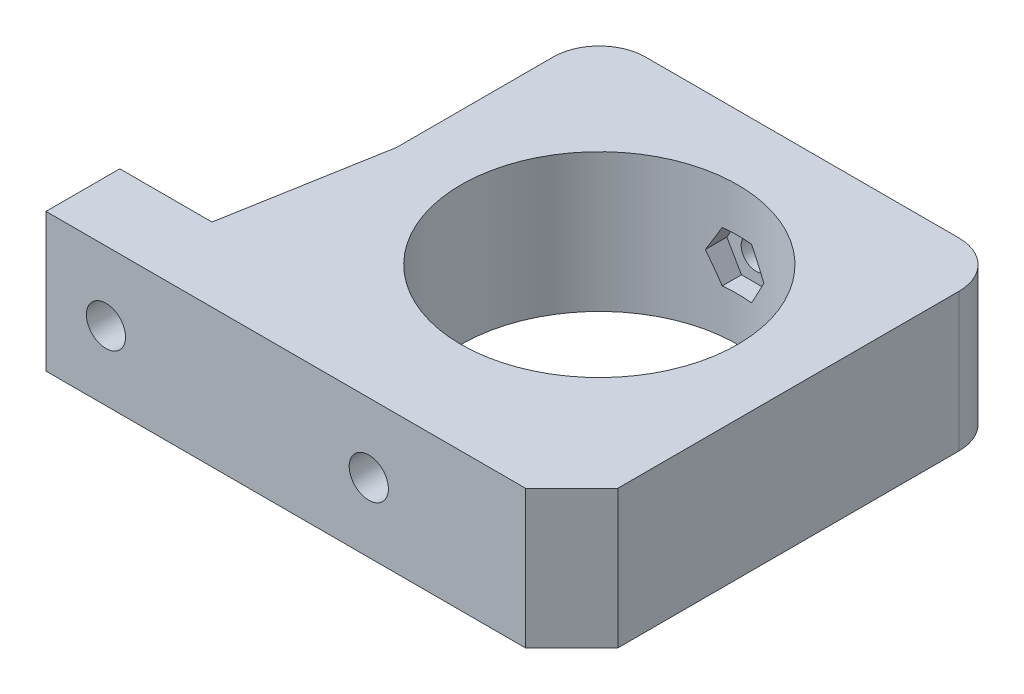
ISO-10303-21;
HEADER;
FILE_DESCRIPTION(('STEP AP214'),'2;1');
FILE_NAME('part.step','',(''),(''),'','','');
FILE_SCHEMA(('AUTOMOTIVE_DESIGN { 1 0 10303 214 1 1 1 1 }'));
ENDSEC;
DATA;
#1=APPLICATION_CONTEXT('core data for automotive mechanical design processes');
#2=APPLICATION_PROTOCOL_DEFINITION('international standard','automotive_design',2000,#1);
#3=PRODUCT_CONTEXT('',#1,'mechanical');
#4=PRODUCT('Part','Part','',(#3));
#5=PRODUCT_RELATED_PRODUCT_CATEGORY('part','',(#4));
#6=PRODUCT_DEFINITION_FORMATION('','',#4);
#7=PRODUCT_DEFINITION_CONTEXT('part definition',#1,'design');
#8=PRODUCT_DEFINITION('design','',#6,#7);
#9=PRODUCT_DEFINITION_SHAPE('','',#8);
#10=(LENGTH_UNIT() NAMED_UNIT(*) SI_UNIT(.MILLI.,.METRE.));
#11=(NAMED_UNIT(*) PLANE_ANGLE_UNIT() SI_UNIT($,.RADIAN.));
#12=(NAMED_UNIT(*) SI_UNIT($,.STERADIAN.) SOLID_ANGLE_UNIT());
#13=UNCERTAINTY_MEASURE_WITH_UNIT(LENGTH_MEASURE(1.E-05),#10,'distance_accuracy_value','');
#14=(GEOMETRIC_REPRESENTATION_CONTEXT(3) GLOBAL_UNCERTAINTY_ASSIGNED_CONTEXT((#13)) GLOBAL_UNIT_ASSIGNED_CONTEXT((#10,
#11,#12)) REPRESENTATION_CONTEXT('',''));
#15=CARTESIAN_POINT('',(0.,0.,0.));
#16=DIRECTION('',(0.,0.,1.));
#17=DIRECTION('',(1.,0.,0.));
#18=AXIS2_PLACEMENT_3D('',#15,#16,#17);
#19=CARTESIAN_POINT('',(-28.5,7.5,-22.001));
#20=DIRECTION('',(0.,0.,1.));
#21=DIRECTION('',(1.,0.,0.));
#22=AXIS2_PLACEMENT_3D('',#19,#20,#21);
#23=CYLINDRICAL_SURFACE('',#22,2.125);
#24=CARTESIAN_POINT('',(-28.5,7.5,25.));
#25=DIRECTION('',(0.,0.,1.));
#26=DIRECTION('',(1.,0.,0.));
#27=AXIS2_PLACEMENT_3D('',#24,#25,#26);
#28=CIRCLE('',#27,2.125);
#29=CARTESIAN_POINT('',(-26.375,7.5,25.));
#30=VERTEX_POINT('',#29);
#31=EDGE_CURVE('E272',#30,#30,#28,.T.);
#32=ORIENTED_EDGE('',*,*,#31,.T.);
#33=EDGE_LOOP('',(#32));
#34=FACE_BOUND('',#33,.T.);
#35=CARTESIAN_POINT('',(-28.5,7.5,20.));
#36=DIRECTION('',(0.,0.,-1.));
#37=DIRECTION('',(-1.,0.,0.));
#38=AXIS2_PLACEMENT_3D('',#35,#36,#37);
#39=CIRCLE('',#38,2.125);
#40=CARTESIAN_POINT('',(-30.625,7.5,20.));
#41=VERTEX_POINT('',#40);
#42=EDGE_CURVE('E297',#41,#41,#39,.F.);
#43=ORIENTED_EDGE('',*,*,#42,.F.);
#44=EDGE_LOOP('',(#43));
#45=FACE_BOUND('',#44,.T.);
#46=ADVANCED_FACE('F58',(#34,#45),#23,.F.);
#47=CARTESIAN_POINT('',(-21.3355704697987,15.,-3.76510067114094));
#48=DIRECTION('',(-0.984783558817937,0.,-0.173785333909048));
#49=DIRECTION('',(-0.173785333909048,0.,0.984783558817937));
#50=AXIS2_PLACEMENT_3D('',#47,#48,#49);
#51=PLANE('',#50);
#52=DIRECTION('',(0.173785333909048,0.,-0.984783558817937));
#53=VECTOR('',#52,1.);
#54=CARTESIAN_POINT('',(-21.3355704697987,0.,-3.76510067114094));
#55=LINE('',#54,#53);
#56=CARTESIAN_POINT('',(-25.,0.,17.));
#57=VERTEX_POINT('',#56);
#58=CARTESIAN_POINT('',(-22.,0.,0.));
#59=VERTEX_POINT('',#58);
#60=EDGE_CURVE('E259',#57,#59,#55,.T.);
#61=ORIENTED_EDGE('',*,*,#60,.F.);
#62=DIRECTION('',(0.,-1.,0.));
#63=VECTOR('',#62,1.);
#64=CARTESIAN_POINT('',(-25.,15.,17.));
#65=LINE('',#64,#63);
#66=CARTESIAN_POINT('',(-25.,5.47927405783631,17.));
#67=VERTEX_POINT('',#66);
#68=EDGE_CURVE('E294',#67,#57,#65,.T.);
#69=ORIENTED_EDGE('',*,*,#68,.F.);
#70=DIRECTION('',(0.,-1.,0.));
#71=VECTOR('',#70,1.);
#72=CARTESIAN_POINT('',(-25.,9.52072594216369,17.));
#73=LINE('',#72,#71);
#74=CARTESIAN_POINT('',(-25.,9.52072594216369,17.));
#75=VERTEX_POINT('',#74);
#76=EDGE_CURVE('E411',#75,#67,#73,.T.);
#77=ORIENTED_EDGE('',*,*,#76,.F.);
#78=CARTESIAN_POINT('',(-25.,15.,17.));
#79=VERTEX_POINT('',#78);
#80=EDGE_CURVE('E264',#79,#75,#65,.T.);
#81=ORIENTED_EDGE('',*,*,#80,.F.);
#82=DIRECTION('',(0.173785333909048,0.,-0.984783558817937));
#83=VECTOR('',#82,1.);
#84=CARTESIAN_POINT('',(-21.3355704697987,15.,-3.76510067114094));
#85=LINE('',#84,#83);
#86=CARTESIAN_POINT('',(-22.,15.,0.));
#87=VERTEX_POINT('',#86);
#88=EDGE_CURVE('E262',#79,#87,#85,.T.);
#89=ORIENTED_EDGE('',*,*,#88,.T.);
#90=DIRECTION('',(0.,-1.,0.));
#91=VECTOR('',#90,1.);
#92=CARTESIAN_POINT('',(-22.,15.,0.));
#93=LINE('',#92,#91);
#94=EDGE_CURVE('E245',#87,#59,#93,.T.);
#95=ORIENTED_EDGE('',*,*,#94,.T.);
#96=EDGE_LOOP('',(#61,#69,#77,#81,#89,#95));
#97=FACE_BOUND('',#96,.T.);
#98=ADVANCED_FACE('F60',(#97),#51,.T.);
#99=CARTESIAN_POINT('',(0.,15.,17.));
#100=DIRECTION('',(0.,0.,-1.));
#101=DIRECTION('',(-1.,0.,0.));
#102=AXIS2_PLACEMENT_3D('',#99,#100,#101);
#103=PLANE('',#102);
#104=DIRECTION('',(0.866025403784439,-0.5,0.));
#105=VECTOR('',#104,1.);
#106=CARTESIAN_POINT('',(-28.5,11.5414518843274,17.));
#107=LINE('',#106,#105);
#108=CARTESIAN_POINT('',(-28.5,11.5414518843274,17.));
#109=VERTEX_POINT('',#108);
#110=EDGE_CURVE('E417',#109,#75,#107,.T.);
#111=ORIENTED_EDGE('',*,*,#110,.F.);
#112=DIRECTION('',(0.866025403784439,0.5,0.));
#113=VECTOR('',#112,1.);
#114=CARTESIAN_POINT('',(-32.,9.52072594216369,17.));
#115=LINE('',#114,#113);
#116=CARTESIAN_POINT('',(-32.,9.52072594216369,17.));
#117=VERTEX_POINT('',#116);
#118=EDGE_CURVE('E443',#117,#109,#115,.T.);
#119=ORIENTED_EDGE('',*,*,#118,.F.);
#120=DIRECTION('',(0.,1.,0.));
#121=VECTOR('',#120,1.);
#122=CARTESIAN_POINT('',(-32.,5.47927405783631,17.));
#123=LINE('',#122,#121);
#124=CARTESIAN_POINT('',(-32.,5.47927405783631,17.));
#125=VERTEX_POINT('',#124);
#126=EDGE_CURVE('E440',#125,#117,#123,.T.);
#127=ORIENTED_EDGE('',*,*,#126,.F.);
#128=DIRECTION('',(-0.866025403784439,0.5,0.));
#129=VECTOR('',#128,1.);
#130=CARTESIAN_POINT('',(-28.5,3.45854811567262,17.));
#131=LINE('',#130,#129);
#132=CARTESIAN_POINT('',(-28.5,3.45854811567262,17.));
#133=VERTEX_POINT('',#132);
#134=EDGE_CURVE('E437',#133,#125,#131,.T.);
#135=ORIENTED_EDGE('',*,*,#134,.F.);
#136=DIRECTION('',(-0.866025403784439,-0.5,0.));
#137=VECTOR('',#136,1.);
#138=CARTESIAN_POINT('',(-25.,5.47927405783631,17.));
#139=LINE('',#138,#137);
#140=EDGE_CURVE('E434',#67,#133,#139,.T.);
#141=ORIENTED_EDGE('',*,*,#140,.F.);
#142=ORIENTED_EDGE('',*,*,#68,.T.);
#143=DIRECTION('',(1.,0.,0.));
#144=VECTOR('',#143,1.);
#145=CARTESIAN_POINT('',(0.,0.,17.));
#146=LINE('',#145,#144);
#147=CARTESIAN_POINT('',(-35.,0.,17.));
#148=VERTEX_POINT('',#147);
#149=EDGE_CURVE('E271',#148,#57,#146,.T.);
#150=ORIENTED_EDGE('',*,*,#149,.F.);
#151=DIRECTION('',(0.,-1.,0.));
#152=VECTOR('',#151,1.);
#153=CARTESIAN_POINT('',(-35.,15.,17.));
#154=LINE('',#153,#152);
#155=CARTESIAN_POINT('',(-35.,15.,17.));
#156=VERTEX_POINT('',#155);
#157=EDGE_CURVE('E292',#156,#148,#154,.T.);
#158=ORIENTED_EDGE('',*,*,#157,.F.);
#159=DIRECTION('',(1.,0.,0.));
#160=VECTOR('',#159,1.);
#161=CARTESIAN_POINT('',(0.,15.,17.));
#162=LINE('',#161,#160);
#163=EDGE_CURVE('E462',#156,#79,#162,.T.);
#164=ORIENTED_EDGE('',*,*,#163,.T.);
#165=ORIENTED_EDGE('',*,*,#80,.T.);
#166=EDGE_LOOP('',(#111,#119,#127,#135,#141,#142,#150,#158,#164,#165));
#167=FACE_BOUND('',#166,.T.);
#168=ADVANCED_FACE('F495',(#167),#103,.T.);
#169=CARTESIAN_POINT('',(-35.,15.,0.));
#170=DIRECTION('',(-1.,0.,0.));
#171=DIRECTION('',(0.,0.,1.));
#172=AXIS2_PLACEMENT_3D('',#169,#170,#171);
#173=PLANE('',#172);
#174=DIRECTION('',(0.,0.,-1.));
#175=VECTOR('',#174,1.);
#176=CARTESIAN_POINT('',(-35.,0.,0.));
#177=LINE('',#176,#175);
#178=CARTESIAN_POINT('',(-35.,0.,25.));
#179=VERTEX_POINT('',#178);
#180=EDGE_CURVE('E274',#179,#148,#177,.T.);
#181=ORIENTED_EDGE('',*,*,#180,.F.);
#182=DIRECTION('',(0.,-1.,0.));
#183=VECTOR('',#182,1.);
#184=CARTESIAN_POINT('',(-35.,15.,25.));
#185=LINE('',#184,#183);
#186=CARTESIAN_POINT('',(-35.,15.,25.));
#187=VERTEX_POINT('',#186);
#188=EDGE_CURVE('E290',#187,#179,#185,.T.);
#189=ORIENTED_EDGE('',*,*,#188,.F.);
#190=DIRECTION('',(0.,0.,-1.));
#191=VECTOR('',#190,1.);
#192=CARTESIAN_POINT('',(-35.,15.,0.));
#193=LINE('',#192,#191);
#194=EDGE_CURVE('E465',#187,#156,#193,.T.);
#195=ORIENTED_EDGE('',*,*,#194,.T.);
#196=ORIENTED_EDGE('',*,*,#157,.T.);
#197=EDGE_LOOP('',(#181,#189,#195,#196));
#198=FACE_BOUND('',#197,.T.);
#199=ADVANCED_FACE('F662',(#198),#173,.T.);
#200=CARTESIAN_POINT('',(0.,15.,25.));
#201=DIRECTION('',(0.,0.,-1.));
#202=DIRECTION('',(-1.,0.,0.));
#203=AXIS2_PLACEMENT_3D('',#200,#201,#202);
#204=PLANE('',#203);
#205=CARTESIAN_POINT('',(0.,7.49999999999659,25.));
#206=DIRECTION('',(0.,0.,1.));
#207=DIRECTION('',(1.,0.,0.));
#208=AXIS2_PLACEMENT_3D('',#205,#206,#207);
#209=CIRCLE('',#208,2.125);
#210=CARTESIAN_POINT('',(2.125,7.49999999999659,25.));
#211=VERTEX_POINT('',#210);
#212=EDGE_CURVE('E277',#211,#211,#209,.T.);
#213=ORIENTED_EDGE('',*,*,#212,.F.);
#214=EDGE_LOOP('',(#213));
#215=FACE_BOUND('',#214,.T.);
#216=ORIENTED_EDGE('',*,*,#31,.F.);
#217=EDGE_LOOP('',(#216));
#218=FACE_BOUND('',#217,.T.);
#219=DIRECTION('',(1.,0.,0.));
#220=VECTOR('',#219,1.);
#221=CARTESIAN_POINT('',(0.,0.,25.));
#222=LINE('',#221,#220);
#223=CARTESIAN_POINT('',(16.9999999999999,0.,25.));
#224=VERTEX_POINT('',#223);
#225=EDGE_CURVE('E284',#179,#224,#222,.T.);
#226=ORIENTED_EDGE('',*,*,#225,.T.);
#227=DIRECTION('',(0.,1.,0.));
#228=VECTOR('',#227,1.);
#229=CARTESIAN_POINT('',(16.9999999999999,0.,25.));
#230=LINE('',#229,#228);
#231=CARTESIAN_POINT('',(16.9999999999999,15.,25.));
#232=VERTEX_POINT('',#231);
#233=EDGE_CURVE('E408',#224,#232,#230,.T.);
#234=ORIENTED_EDGE('',*,*,#233,.T.);
#235=DIRECTION('',(1.,0.,0.));
#236=VECTOR('',#235,1.);
#237=CARTESIAN_POINT('',(0.,15.,25.));
#238=LINE('',#237,#236);
#239=EDGE_CURVE('E467',#187,#232,#238,.T.);
#240=ORIENTED_EDGE('',*,*,#239,.F.);
#241=ORIENTED_EDGE('',*,*,#188,.T.);
#242=EDGE_LOOP('',(#226,#234,#240,#241));
#243=FACE_BOUND('',#242,.T.);
#244=ADVANCED_FACE('F487',(#215,#218,#243),#204,.F.);
#245=CARTESIAN_POINT('',(0.,15.,0.));
#246=DIRECTION('',(0.,-1.,0.));
#247=DIRECTION('',(0.,0.,-1.));
#248=AXIS2_PLACEMENT_3D('',#245,#246,#247);
#249=CYLINDRICAL_SURFACE('',#248,15.);
#250=CARTESIAN_POINT('',(0.,4.74999999999659,0.));
#251=DIRECTION('',(0.,-1.,0.));
#252=DIRECTION('',(0.,0.,-1.));
#253=AXIS2_PLACEMENT_3D('',#250,#251,#252);
#254=CIRCLE('',#253,15.);
#255=CARTESIAN_POINT('',(-1.58771324027147,4.74999999999659,-14.9157355389088));
#256=VERTEX_POINT('',#255);
#257=CARTESIAN_POINT('',(1.58771324027147,4.74999999999659,-14.9157355389088));
#258=VERTEX_POINT('',#257);
#259=EDGE_CURVE('E12',#256,#258,#254,.T.);
#260=ORIENTED_EDGE('',*,*,#259,.F.);
#261=CARTESIAN_POINT('',(0.,1.99999999999659,0.));
#262=DIRECTION('',(-0.866025403784439,-0.5,0.));
#263=DIRECTION('',(0.5,-0.866025403784439,0.));
#264=AXIS2_PLACEMENT_3D('',#261,#262,#263);
#265=ELLIPSE('',#264,30.,15.);
#266=CARTESIAN_POINT('',(-3.17542648054294,7.49999999999659,-14.6600363801277));
#267=VERTEX_POINT('',#266);
#268=EDGE_CURVE('E66',#267,#256,#265,.T.);
#269=ORIENTED_EDGE('',*,*,#268,.F.);
#270=CARTESIAN_POINT('',(0.,12.9999999999966,0.));
#271=DIRECTION('',(-0.866025403784439,0.5,0.));
#272=DIRECTION('',(-0.5,-0.866025403784439,0.));
#273=AXIS2_PLACEMENT_3D('',#270,#271,#272);
#274=ELLIPSE('',#273,30.,15.);
#275=CARTESIAN_POINT('',(-1.58771324027147,10.2499999999966,-14.9157355389088));
#276=VERTEX_POINT('',#275);
#277=EDGE_CURVE('E306',#276,#267,#274,.T.);
#278=ORIENTED_EDGE('',*,*,#277,.F.);
#279=CARTESIAN_POINT('',(0.,10.2499999999966,0.));
#280=DIRECTION('',(0.,1.,0.));
#281=DIRECTION('',(-1.,0.,0.));
#282=AXIS2_PLACEMENT_3D('',#279,#280,#281);
#283=CIRCLE('',#282,15.);
#284=CARTESIAN_POINT('',(1.58771324027147,10.2499999999966,-14.9157355389088));
#285=VERTEX_POINT('',#284);
#286=EDGE_CURVE('E304',#285,#276,#283,.T.);
#287=ORIENTED_EDGE('',*,*,#286,.F.);
#288=CARTESIAN_POINT('',(0.,12.9999999999966,0.));
#289=DIRECTION('',(0.866025403784439,0.5,0.));
#290=DIRECTION('',(0.5,-0.866025403784439,0.));
#291=AXIS2_PLACEMENT_3D('',#288,#289,#290);
#292=ELLIPSE('',#291,30.,15.);
#293=CARTESIAN_POINT('',(3.17542648054294,7.49999999999659,-14.6600363801277));
#294=VERTEX_POINT('',#293);
#295=EDGE_CURVE('E302',#294,#285,#292,.T.);
#296=ORIENTED_EDGE('',*,*,#295,.F.);
#297=CARTESIAN_POINT('',(0.,1.99999999999659,0.));
#298=DIRECTION('',(0.866025403784439,-0.5,0.));
#299=DIRECTION('',(-0.5,-0.866025403784439,0.));
#300=AXIS2_PLACEMENT_3D('',#297,#298,#299);
#301=ELLIPSE('',#300,30.,15.);
#302=EDGE_CURVE('E263',#258,#294,#301,.T.);
#303=ORIENTED_EDGE('',*,*,#302,.F.);
#304=EDGE_LOOP('',(#260,#269,#278,#287,#296,#303));
#305=FACE_BOUND('',#304,.T.);
#306=CARTESIAN_POINT('',(0.,0.49999999999659,0.));
#307=DIRECTION('',(0.866025403784439,-0.5,0.));
#308=DIRECTION('',(-0.5,-0.866025403784439,0.));
#309=AXIS2_PLACEMENT_3D('',#306,#307,#308);
#310=ELLIPSE('',#309,30.,15.);
#311=CARTESIAN_POINT('',(2.02072594216369,3.99999999999659,14.8632656797444));
#312=VERTEX_POINT('',#311);
#313=CARTESIAN_POINT('',(4.04145188432738,7.49999999999659,14.4452991200136));
#314=VERTEX_POINT('',#313);
#315=EDGE_CURVE('E394',#312,#314,#310,.F.);
#316=ORIENTED_EDGE('',*,*,#315,.T.);
#317=CARTESIAN_POINT('',(0.,14.4999999999966,0.));
#318=DIRECTION('',(0.866025403784439,0.5,0.));
#319=DIRECTION('',(0.5,-0.866025403784439,0.));
#320=AXIS2_PLACEMENT_3D('',#317,#318,#319);
#321=ELLIPSE('',#320,30.,15.);
#322=CARTESIAN_POINT('',(2.02072594216369,10.9999999999966,14.8632656797443));
#323=VERTEX_POINT('',#322);
#324=EDGE_CURVE('E325',#314,#323,#321,.F.);
#325=ORIENTED_EDGE('',*,*,#324,.T.);
#326=CARTESIAN_POINT('',(0.,10.9999999999966,0.));
#327=DIRECTION('',(0.,1.,0.));
#328=DIRECTION('',(0.,0.,1.));
#329=AXIS2_PLACEMENT_3D('',#326,#327,#328);
#330=CIRCLE('',#329,15.);
#331=CARTESIAN_POINT('',(-2.02072594216369,10.9999999999966,14.8632656797444));
#332=VERTEX_POINT('',#331);
#333=EDGE_CURVE('E351',#323,#332,#330,.F.);
#334=ORIENTED_EDGE('',*,*,#333,.T.);
#335=CARTESIAN_POINT('',(0.,14.4999999999966,0.));
#336=DIRECTION('',(-0.866025403784438,0.5,0.));
#337=DIRECTION('',(-0.5,-0.866025403784439,0.));
#338=AXIS2_PLACEMENT_3D('',#335,#336,#337);
#339=ELLIPSE('',#338,30.,15.);
#340=CARTESIAN_POINT('',(-4.04145188432738,7.49999999999659,14.4452991200136));
#341=VERTEX_POINT('',#340);
#342=EDGE_CURVE('E354',#332,#341,#339,.F.);
#343=ORIENTED_EDGE('',*,*,#342,.T.);
#344=CARTESIAN_POINT('',(0.,0.499999999996583,0.));
#345=DIRECTION('',(-0.866025403784439,-0.5,0.));
#346=DIRECTION('',(0.5,-0.866025403784439,0.));
#347=AXIS2_PLACEMENT_3D('',#344,#345,#346);
#348=ELLIPSE('',#347,30.,15.);
#349=CARTESIAN_POINT('',(-2.02072594216369,3.99999999999659,14.8632656797444));
#350=VERTEX_POINT('',#349);
#351=EDGE_CURVE('E357',#341,#350,#348,.F.);
#352=ORIENTED_EDGE('',*,*,#351,.T.);
#353=CARTESIAN_POINT('',(0.,3.99999999999659,0.));
#354=DIRECTION('',(0.,-1.,0.));
#355=DIRECTION('',(1.,0.,0.));
#356=AXIS2_PLACEMENT_3D('',#353,#354,#355);
#357=CIRCLE('',#356,15.);
#358=EDGE_CURVE('E360',#350,#312,#357,.F.);
#359=ORIENTED_EDGE('',*,*,#358,.T.);
#360=EDGE_LOOP('',(#316,#325,#334,#343,#352,#359));
#361=FACE_BOUND('',#360,.T.);
#362=CARTESIAN_POINT('',(0.,15.,0.));
#363=DIRECTION('',(0.,1.,0.));
#364=DIRECTION('',(0.,0.,1.));
#365=AXIS2_PLACEMENT_3D('',#362,#363,#364);
#366=CIRCLE('',#365,15.);
#367=CARTESIAN_POINT('',(0.,15.,15.));
#368=VERTEX_POINT('',#367);
#369=EDGE_CURVE('E280',#368,#368,#366,.T.);
#370=ORIENTED_EDGE('',*,*,#369,.T.);
#371=EDGE_LOOP('',(#370));
#372=FACE_BOUND('',#371,.T.);
#373=CARTESIAN_POINT('',(0.,0.,0.));
#374=DIRECTION('',(0.,1.,0.));
#375=DIRECTION('',(0.,0.,1.));
#376=AXIS2_PLACEMENT_3D('',#373,#374,#375);
#377=CIRCLE('',#376,15.);
#378=CARTESIAN_POINT('',(0.,0.,15.));
#379=VERTEX_POINT('',#378);
#380=EDGE_CURVE('E287',#379,#379,#377,.T.);
#381=ORIENTED_EDGE('',*,*,#380,.F.);
#382=EDGE_LOOP('',(#381));
#383=FACE_BOUND('',#382,.T.);
#384=ADVANCED_FACE('F327',(#305,#361,#372,#383),#249,.F.);
#385=CARTESIAN_POINT('',(0.,15.,0.));
#386=DIRECTION('',(0.,1.,0.));
#387=DIRECTION('',(0.,0.,1.));
#388=AXIS2_PLACEMENT_3D('',#385,#386,#387);
#389=PLANE('',#388);
#390=DIRECTION('',(-0.707106781186551,0.,0.707106781186544));
#391=VECTOR('',#390,1.);
#392=CARTESIAN_POINT('',(20.9999999999999,15.,21.0000000000001));
#393=LINE('',#392,#391);
#394=CARTESIAN_POINT('',(22.,15.,20.));
#395=VERTEX_POINT('',#394);
#396=EDGE_CURVE('E401',#395,#232,#393,.T.);
#397=ORIENTED_EDGE('',*,*,#396,.F.);
#398=DIRECTION('',(0.,0.,1.));
#399=VECTOR('',#398,1.);
#400=CARTESIAN_POINT('',(22.,15.,0.));
#401=LINE('',#400,#399);
#402=CARTESIAN_POINT('',(22.,15.,-17.));
#403=VERTEX_POINT('',#402);
#404=EDGE_CURVE('E397',#403,#395,#401,.T.);
#405=ORIENTED_EDGE('',*,*,#404,.F.);
#406=CARTESIAN_POINT('',(17.,15.,-17.));
#407=DIRECTION('',(0.,1.,0.));
#408=DIRECTION('',(0.,0.,1.));
#409=AXIS2_PLACEMENT_3D('',#406,#407,#408);
#410=CIRCLE('',#409,5.);
#411=CARTESIAN_POINT('',(17.,15.,-22.));
#412=VERTEX_POINT('',#411);
#413=EDGE_CURVE('E615',#403,#412,#410,.T.);
#414=ORIENTED_EDGE('',*,*,#413,.T.);
#415=DIRECTION('',(1.,0.,0.));
#416=VECTOR('',#415,1.);
#417=CARTESIAN_POINT('',(0.,15.,-22.));
#418=LINE('',#417,#416);
#419=CARTESIAN_POINT('',(-17.,15.,-22.));
#420=VERTEX_POINT('',#419);
#421=EDGE_CURVE('E631',#420,#412,#418,.T.);
#422=ORIENTED_EDGE('',*,*,#421,.F.);
#423=CARTESIAN_POINT('',(-17.,15.,-17.));
#424=DIRECTION('',(0.,1.,0.));
#425=DIRECTION('',(0.,0.,1.));
#426=AXIS2_PLACEMENT_3D('',#423,#424,#425);
#427=CIRCLE('',#426,5.);
#428=CARTESIAN_POINT('',(-22.,15.,-17.));
#429=VERTEX_POINT('',#428);
#430=EDGE_CURVE('E616',#420,#429,#427,.T.);
#431=ORIENTED_EDGE('',*,*,#430,.T.);
#432=DIRECTION('',(0.,0.,-1.));
#433=VECTOR('',#432,1.);
#434=CARTESIAN_POINT('',(-22.,15.,0.));
#435=LINE('',#434,#433);
#436=EDGE_CURVE('E252',#87,#429,#435,.T.);
#437=ORIENTED_EDGE('',*,*,#436,.F.);
#438=ORIENTED_EDGE('',*,*,#88,.F.);
#439=ORIENTED_EDGE('',*,*,#163,.F.);
#440=ORIENTED_EDGE('',*,*,#194,.F.);
#441=ORIENTED_EDGE('',*,*,#239,.T.);
#442=EDGE_LOOP('',(#397,#405,#414,#422,#431,#437,#438,#439,#440,#441));
#443=FACE_BOUND('',#442,.T.);
#444=ORIENTED_EDGE('',*,*,#369,.F.);
#445=EDGE_LOOP('',(#444));
#446=FACE_BOUND('',#445,.T.);
#447=ADVANCED_FACE('F478',(#443,#446),#389,.T.);
#448=CARTESIAN_POINT('',(0.,0.,0.));
#449=DIRECTION('',(0.,1.,0.));
#450=DIRECTION('',(0.,0.,1.));
#451=AXIS2_PLACEMENT_3D('',#448,#449,#450);
#452=PLANE('',#451);
#453=DIRECTION('',(0.,0.,1.));
#454=VECTOR('',#453,1.);
#455=CARTESIAN_POINT('',(22.,0.,0.));
#456=LINE('',#455,#454);
#457=CARTESIAN_POINT('',(22.,0.,-17.));
#458=VERTEX_POINT('',#457);
#459=CARTESIAN_POINT('',(22.,0.,20.));
#460=VERTEX_POINT('',#459);
#461=EDGE_CURVE('E398',#458,#460,#456,.T.);
#462=ORIENTED_EDGE('',*,*,#461,.T.);
#463=DIRECTION('',(-0.707106781186551,0.,0.707106781186544));
#464=VECTOR('',#463,1.);
#465=CARTESIAN_POINT('',(20.9999999999999,0.,21.0000000000001));
#466=LINE('',#465,#464);
#467=EDGE_CURVE('E400',#460,#224,#466,.T.);
#468=ORIENTED_EDGE('',*,*,#467,.T.);
#469=ORIENTED_EDGE('',*,*,#225,.F.);
#470=ORIENTED_EDGE('',*,*,#180,.T.);
#471=ORIENTED_EDGE('',*,*,#149,.T.);
#472=ORIENTED_EDGE('',*,*,#60,.T.);
#473=DIRECTION('',(0.,0.,1.));
#474=VECTOR('',#473,1.);
#475=CARTESIAN_POINT('',(-22.,0.,0.));
#476=LINE('',#475,#474);
#477=CARTESIAN_POINT('',(-22.,0.,-17.));
#478=VERTEX_POINT('',#477);
#479=EDGE_CURVE('E241',#478,#59,#476,.T.);
#480=ORIENTED_EDGE('',*,*,#479,.F.);
#481=CARTESIAN_POINT('',(-17.,0.,-17.));
#482=DIRECTION('',(0.,1.,0.));
#483=DIRECTION('',(0.,0.,1.));
#484=AXIS2_PLACEMENT_3D('',#481,#482,#483);
#485=CIRCLE('',#484,5.);
#486=CARTESIAN_POINT('',(-17.,0.,-22.));
#487=VERTEX_POINT('',#486);
#488=EDGE_CURVE('E613',#478,#487,#485,.F.);
#489=ORIENTED_EDGE('',*,*,#488,.T.);
#490=DIRECTION('',(-1.,0.,0.));
#491=VECTOR('',#490,1.);
#492=CARTESIAN_POINT('',(0.,0.,-22.));
#493=LINE('',#492,#491);
#494=CARTESIAN_POINT('',(17.,0.,-22.));
#495=VERTEX_POINT('',#494);
#496=EDGE_CURVE('E626',#495,#487,#493,.T.);
#497=ORIENTED_EDGE('',*,*,#496,.F.);
#498=CARTESIAN_POINT('',(17.,0.,-17.));
#499=DIRECTION('',(0.,1.,0.));
#500=DIRECTION('',(0.,0.,1.));
#501=AXIS2_PLACEMENT_3D('',#498,#499,#500);
#502=CIRCLE('',#501,5.);
#503=EDGE_CURVE('E623',#495,#458,#502,.F.);
#504=ORIENTED_EDGE('',*,*,#503,.T.);
#505=EDGE_LOOP('',(#462,#468,#469,#470,#471,#472,#480,#489,#497,#504));
#506=FACE_BOUND('',#505,.T.);
#507=ORIENTED_EDGE('',*,*,#380,.T.);
#508=EDGE_LOOP('',(#507));
#509=FACE_BOUND('',#508,.T.);
#510=ADVANCED_FACE('F267',(#506,#509),#452,.F.);
#511=CARTESIAN_POINT('',(0.,7.49999999999659,-22.001));
#512=DIRECTION('',(0.,0.,1.));
#513=DIRECTION('',(1.,0.,0.));
#514=AXIS2_PLACEMENT_3D('',#511,#512,#513);
#515=CYLINDRICAL_SURFACE('',#514,2.125);
#516=CARTESIAN_POINT('',(0.,7.49999999999659,21.));
#517=DIRECTION('',(0.,0.,1.));
#518=DIRECTION('',(1.,0.,0.));
#519=AXIS2_PLACEMENT_3D('',#516,#517,#518);
#520=CIRCLE('',#519,2.125);
#521=CARTESIAN_POINT('',(2.125,7.49999999999659,21.));
#522=VERTEX_POINT('',#521);
#523=EDGE_CURVE('E382',#522,#522,#520,.T.);
#524=ORIENTED_EDGE('',*,*,#523,.F.);
#525=EDGE_LOOP('',(#524));
#526=FACE_BOUND('',#525,.T.);
#527=ORIENTED_EDGE('',*,*,#212,.T.);
#528=EDGE_LOOP('',(#527));
#529=FACE_BOUND('',#528,.T.);
#530=ADVANCED_FACE('F485',(#526,#529),#515,.F.);
#531=CARTESIAN_POINT('',(0.,0.,20.));
#532=DIRECTION('',(0.,0.,-1.));
#533=DIRECTION('',(-1.,0.,0.));
#534=AXIS2_PLACEMENT_3D('',#531,#532,#533);
#535=PLANE('',#534);
#536=DIRECTION('',(0.,-1.,0.));
#537=VECTOR('',#536,1.);
#538=CARTESIAN_POINT('',(-25.,9.52072594216369,20.));
#539=LINE('',#538,#537);
#540=CARTESIAN_POINT('',(-25.,9.52072594216369,20.));
#541=VERTEX_POINT('',#540);
#542=CARTESIAN_POINT('',(-25.,5.47927405783631,20.));
#543=VERTEX_POINT('',#542);
#544=EDGE_CURVE('E413',#541,#543,#539,.T.);
#545=ORIENTED_EDGE('',*,*,#544,.T.);
#546=DIRECTION('',(-0.866025403784439,-0.5,0.));
#547=VECTOR('',#546,1.);
#548=CARTESIAN_POINT('',(-25.,5.47927405783631,20.));
#549=LINE('',#548,#547);
#550=CARTESIAN_POINT('',(-28.5,3.45854811567262,20.));
#551=VERTEX_POINT('',#550);
#552=EDGE_CURVE('E416',#543,#551,#549,.T.);
#553=ORIENTED_EDGE('',*,*,#552,.T.);
#554=DIRECTION('',(-0.866025403784439,0.5,0.));
#555=VECTOR('',#554,1.);
#556=CARTESIAN_POINT('',(-28.5,3.45854811567262,20.));
#557=LINE('',#556,#555);
#558=CARTESIAN_POINT('',(-32.,5.47927405783631,20.));
#559=VERTEX_POINT('',#558);
#560=EDGE_CURVE('E420',#551,#559,#557,.T.);
#561=ORIENTED_EDGE('',*,*,#560,.T.);
#562=DIRECTION('',(0.,1.,0.));
#563=VECTOR('',#562,1.);
#564=CARTESIAN_POINT('',(-32.,5.47927405783631,20.));
#565=LINE('',#564,#563);
#566=CARTESIAN_POINT('',(-32.,9.52072594216369,20.));
#567=VERTEX_POINT('',#566);
#568=EDGE_CURVE('E423',#559,#567,#565,.T.);
#569=ORIENTED_EDGE('',*,*,#568,.T.);
#570=DIRECTION('',(0.866025403784439,0.5,0.));
#571=VECTOR('',#570,1.);
#572=CARTESIAN_POINT('',(-32.,9.52072594216369,20.));
#573=LINE('',#572,#571);
#574=CARTESIAN_POINT('',(-28.5,11.5414518843274,20.));
#575=VERTEX_POINT('',#574);
#576=EDGE_CURVE('E426',#567,#575,#573,.T.);
#577=ORIENTED_EDGE('',*,*,#576,.T.);
#578=DIRECTION('',(0.866025403784439,-0.5,0.));
#579=VECTOR('',#578,1.);
#580=CARTESIAN_POINT('',(-28.5,11.5414518843274,20.));
#581=LINE('',#580,#579);
#582=EDGE_CURVE('E429',#575,#541,#581,.T.);
#583=ORIENTED_EDGE('',*,*,#582,.T.);
#584=EDGE_LOOP('',(#545,#553,#561,#569,#577,#583));
#585=FACE_BOUND('',#584,.T.);
#586=ORIENTED_EDGE('',*,*,#42,.T.);
#587=EDGE_LOOP('',(#586));
#588=FACE_BOUND('',#587,.T.);
#589=ADVANCED_FACE('F500',(#585,#588),#535,.T.);
#590=CARTESIAN_POINT('',(-25.,9.52072594216369,20.));
#591=DIRECTION('',(1.,0.,0.));
#592=DIRECTION('',(0.,0.,-1.));
#593=AXIS2_PLACEMENT_3D('',#590,#591,#592);
#594=PLANE('',#593);
#595=ORIENTED_EDGE('',*,*,#76,.T.);
#596=DIRECTION('',(0.,0.,-1.));
#597=VECTOR('',#596,1.);
#598=CARTESIAN_POINT('',(-25.,5.47927405783631,20.));
#599=LINE('',#598,#597);
#600=EDGE_CURVE('E432',#543,#67,#599,.T.);
#601=ORIENTED_EDGE('',*,*,#600,.F.);
#602=ORIENTED_EDGE('',*,*,#544,.F.);
#603=DIRECTION('',(0.,0.,-1.));
#604=VECTOR('',#603,1.);
#605=CARTESIAN_POINT('',(-25.,9.52072594216369,20.));
#606=LINE('',#605,#604);
#607=EDGE_CURVE('E300',#541,#75,#606,.T.);
#608=ORIENTED_EDGE('',*,*,#607,.T.);
#609=EDGE_LOOP('',(#595,#601,#602,#608));
#610=FACE_BOUND('',#609,.T.);
#611=ADVANCED_FACE('F502',(#610),#594,.F.);
#612=CARTESIAN_POINT('',(-28.5,11.5414518843274,20.));
#613=DIRECTION('',(0.5,0.866025403784439,0.));
#614=DIRECTION('',(-0.866025403784439,0.5,0.));
#615=AXIS2_PLACEMENT_3D('',#612,#613,#614);
#616=PLANE('',#615);
#617=ORIENTED_EDGE('',*,*,#110,.T.);
#618=ORIENTED_EDGE('',*,*,#607,.F.);
#619=ORIENTED_EDGE('',*,*,#582,.F.);
#620=DIRECTION('',(0.,0.,-1.));
#621=VECTOR('',#620,1.);
#622=CARTESIAN_POINT('',(-28.5,11.5414518843274,20.));
#623=LINE('',#622,#621);
#624=EDGE_CURVE('E449',#575,#109,#623,.T.);
#625=ORIENTED_EDGE('',*,*,#624,.T.);
#626=EDGE_LOOP('',(#617,#618,#619,#625));
#627=FACE_BOUND('',#626,.T.);
#628=ADVANCED_FACE('F505',(#627),#616,.F.);
#629=CARTESIAN_POINT('',(-32.,9.52072594216369,20.));
#630=DIRECTION('',(-0.5,0.866025403784439,0.));
#631=DIRECTION('',(-0.866025403784439,-0.5,0.));
#632=AXIS2_PLACEMENT_3D('',#629,#630,#631);
#633=PLANE('',#632);
#634=ORIENTED_EDGE('',*,*,#118,.T.);
#635=ORIENTED_EDGE('',*,*,#624,.F.);
#636=ORIENTED_EDGE('',*,*,#576,.F.);
#637=DIRECTION('',(0.,0.,-1.));
#638=VECTOR('',#637,1.);
#639=CARTESIAN_POINT('',(-32.,9.52072594216369,20.));
#640=LINE('',#639,#638);
#641=EDGE_CURVE('E451',#567,#117,#640,.T.);
#642=ORIENTED_EDGE('',*,*,#641,.T.);
#643=EDGE_LOOP('',(#634,#635,#636,#642));
#644=FACE_BOUND('',#643,.T.);
#645=ADVANCED_FACE('F519',(#644),#633,.F.);
#646=CARTESIAN_POINT('',(-32.,5.47927405783631,20.));
#647=DIRECTION('',(-1.,0.,0.));
#648=DIRECTION('',(0.,0.,1.));
#649=AXIS2_PLACEMENT_3D('',#646,#647,#648);
#650=PLANE('',#649);
#651=ORIENTED_EDGE('',*,*,#126,.T.);
#652=ORIENTED_EDGE('',*,*,#641,.F.);
#653=ORIENTED_EDGE('',*,*,#568,.F.);
#654=DIRECTION('',(0.,0.,-1.));
#655=VECTOR('',#654,1.);
#656=CARTESIAN_POINT('',(-32.,5.47927405783631,20.));
#657=LINE('',#656,#655);
#658=EDGE_CURVE('E453',#559,#125,#657,.T.);
#659=ORIENTED_EDGE('',*,*,#658,.T.);
#660=EDGE_LOOP('',(#651,#652,#653,#659));
#661=FACE_BOUND('',#660,.T.);
#662=ADVANCED_FACE('F515',(#661),#650,.F.);
#663=CARTESIAN_POINT('',(-28.5,3.45854811567262,20.));
#664=DIRECTION('',(-0.5,-0.866025403784438,0.));
#665=DIRECTION('',(0.866025403784439,-0.5,0.));
#666=AXIS2_PLACEMENT_3D('',#663,#664,#665);
#667=PLANE('',#666);
#668=ORIENTED_EDGE('',*,*,#134,.T.);
#669=ORIENTED_EDGE('',*,*,#658,.F.);
#670=ORIENTED_EDGE('',*,*,#560,.F.);
#671=DIRECTION('',(0.,0.,-1.));
#672=VECTOR('',#671,1.);
#673=CARTESIAN_POINT('',(-28.5,3.45854811567262,20.));
#674=LINE('',#673,#672);
#675=EDGE_CURVE('E455',#551,#133,#674,.T.);
#676=ORIENTED_EDGE('',*,*,#675,.T.);
#677=EDGE_LOOP('',(#668,#669,#670,#676));
#678=FACE_BOUND('',#677,.T.);
#679=ADVANCED_FACE('F511',(#678),#667,.F.);
#680=CARTESIAN_POINT('',(-25.,5.47927405783631,20.));
#681=DIRECTION('',(0.5,-0.866025403784438,0.));
#682=DIRECTION('',(0.866025403784439,0.5,0.));
#683=AXIS2_PLACEMENT_3D('',#680,#681,#682);
#684=PLANE('',#683);
#685=ORIENTED_EDGE('',*,*,#140,.T.);
#686=ORIENTED_EDGE('',*,*,#675,.F.);
#687=ORIENTED_EDGE('',*,*,#552,.F.);
#688=ORIENTED_EDGE('',*,*,#600,.T.);
#689=EDGE_LOOP('',(#685,#686,#687,#688));
#690=FACE_BOUND('',#689,.T.);
#691=ADVANCED_FACE('F507',(#690),#684,.F.);
#692=CARTESIAN_POINT('',(20.9999999999999,0.,21.0000000000001));
#693=DIRECTION('',(-0.707106781186544,0.,-0.707106781186551));
#694=DIRECTION('',(-0.707106781186551,0.,0.707106781186544));
#695=AXIS2_PLACEMENT_3D('',#692,#693,#694);
#696=PLANE('',#695);
#697=ORIENTED_EDGE('',*,*,#396,.T.);
#698=ORIENTED_EDGE('',*,*,#233,.F.);
#699=ORIENTED_EDGE('',*,*,#467,.F.);
#700=DIRECTION('',(0.,1.,0.));
#701=VECTOR('',#700,1.);
#702=CARTESIAN_POINT('',(22.,0.,20.));
#703=LINE('',#702,#701);
#704=EDGE_CURVE('E404',#460,#395,#703,.T.);
#705=ORIENTED_EDGE('',*,*,#704,.T.);
#706=EDGE_LOOP('',(#697,#698,#699,#705));
#707=FACE_BOUND('',#706,.T.);
#708=ADVANCED_FACE('F510',(#707),#696,.F.);
#709=CARTESIAN_POINT('',(22.,0.,0.));
#710=DIRECTION('',(-1.,0.,0.));
#711=DIRECTION('',(0.,0.,1.));
#712=AXIS2_PLACEMENT_3D('',#709,#710,#711);
#713=PLANE('',#712);
#714=ORIENTED_EDGE('',*,*,#404,.T.);
#715=ORIENTED_EDGE('',*,*,#704,.F.);
#716=ORIENTED_EDGE('',*,*,#461,.F.);
#717=DIRECTION('',(0.,1.,0.));
#718=VECTOR('',#717,1.);
#719=CARTESIAN_POINT('',(22.,-31.1126983722081,-17.));
#720=LINE('',#719,#718);
#721=EDGE_CURVE('E634',#458,#403,#720,.T.);
#722=ORIENTED_EDGE('',*,*,#721,.T.);
#723=EDGE_LOOP('',(#714,#715,#716,#722));
#724=FACE_BOUND('',#723,.T.);
#725=ADVANCED_FACE('F530',(#724),#713,.F.);
#726=CARTESIAN_POINT('',(0.,0.,21.));
#727=DIRECTION('',(0.,0.,1.));
#728=DIRECTION('',(1.,0.,0.));
#729=AXIS2_PLACEMENT_3D('',#726,#727,#728);
#730=PLANE('',#729);
#731=DIRECTION('',(1.,0.,0.));
#732=VECTOR('',#731,1.);
#733=CARTESIAN_POINT('',(-2.02072594216369,3.99999999999659,21.));
#734=LINE('',#733,#732);
#735=CARTESIAN_POINT('',(-2.02072594216369,3.99999999999659,21.));
#736=VERTEX_POINT('',#735);
#737=CARTESIAN_POINT('',(2.02072594216369,3.99999999999659,21.));
#738=VERTEX_POINT('',#737);
#739=EDGE_CURVE('E363',#736,#738,#734,.T.);
#740=ORIENTED_EDGE('',*,*,#739,.F.);
#741=DIRECTION('',(0.5,-0.866025403784439,0.));
#742=VECTOR('',#741,1.);
#743=CARTESIAN_POINT('',(-4.04145188432738,7.49999999999659,21.));
#744=LINE('',#743,#742);
#745=CARTESIAN_POINT('',(-4.04145188432738,7.49999999999659,21.));
#746=VERTEX_POINT('',#745);
#747=EDGE_CURVE('E377',#746,#736,#744,.T.);
#748=ORIENTED_EDGE('',*,*,#747,.F.);
#749=DIRECTION('',(-0.5,-0.866025403784438,0.));
#750=VECTOR('',#749,1.);
#751=CARTESIAN_POINT('',(-2.02072594216369,10.9999999999966,21.));
#752=LINE('',#751,#750);
#753=CARTESIAN_POINT('',(-2.02072594216369,10.9999999999966,21.));
#754=VERTEX_POINT('',#753);
#755=EDGE_CURVE('E374',#754,#746,#752,.T.);
#756=ORIENTED_EDGE('',*,*,#755,.F.);
#757=DIRECTION('',(-1.,0.,0.));
#758=VECTOR('',#757,1.);
#759=CARTESIAN_POINT('',(2.02072594216369,10.9999999999966,21.));
#760=LINE('',#759,#758);
#761=CARTESIAN_POINT('',(2.02072594216369,10.9999999999966,21.));
#762=VERTEX_POINT('',#761);
#763=EDGE_CURVE('E371',#762,#754,#760,.T.);
#764=ORIENTED_EDGE('',*,*,#763,.F.);
#765=DIRECTION('',(-0.5,0.866025403784439,0.));
#766=VECTOR('',#765,1.);
#767=CARTESIAN_POINT('',(4.04145188432738,7.49999999999659,21.));
#768=LINE('',#767,#766);
#769=CARTESIAN_POINT('',(4.04145188432738,7.49999999999659,21.));
#770=VERTEX_POINT('',#769);
#771=EDGE_CURVE('E368',#770,#762,#768,.T.);
#772=ORIENTED_EDGE('',*,*,#771,.F.);
#773=DIRECTION('',(0.5,0.866025403784438,0.));
#774=VECTOR('',#773,1.);
#775=CARTESIAN_POINT('',(2.02072594216369,3.99999999999659,21.));
#776=LINE('',#775,#774);
#777=EDGE_CURVE('E365',#738,#770,#776,.T.);
#778=ORIENTED_EDGE('',*,*,#777,.F.);
#779=EDGE_LOOP('',(#740,#748,#756,#764,#772,#778));
#780=FACE_BOUND('',#779,.T.);
#781=ORIENTED_EDGE('',*,*,#523,.T.);
#782=EDGE_LOOP('',(#781));
#783=FACE_BOUND('',#782,.T.);
#784=ADVANCED_FACE('F533',(#780,#783),#730,.F.);
#785=CARTESIAN_POINT('',(2.02072594216369,3.99999999999659,-22.001));
#786=DIRECTION('',(0.866025403784439,-0.5,0.));
#787=DIRECTION('',(0.5,0.866025403784439,0.));
#788=AXIS2_PLACEMENT_3D('',#785,#786,#787);
#789=PLANE('',#788);
#790=DIRECTION('',(0.,0.,1.));
#791=VECTOR('',#790,1.);
#792=CARTESIAN_POINT('',(2.02072594216369,3.99999999999659,-22.001));
#793=LINE('',#792,#791);
#794=EDGE_CURVE('E80',#312,#738,#793,.T.);
#795=ORIENTED_EDGE('',*,*,#794,.T.);
#796=ORIENTED_EDGE('',*,*,#777,.T.);
#797=DIRECTION('',(0.,0.,1.));
#798=VECTOR('',#797,1.);
#799=CARTESIAN_POINT('',(4.04145188432738,7.49999999999659,-22.001));
#800=LINE('',#799,#798);
#801=EDGE_CURVE('E389',#314,#770,#800,.T.);
#802=ORIENTED_EDGE('',*,*,#801,.F.);
#803=ORIENTED_EDGE('',*,*,#315,.F.);
#804=EDGE_LOOP('',(#795,#796,#802,#803));
#805=FACE_BOUND('',#804,.T.);
#806=ADVANCED_FACE('F542',(#805),#789,.F.);
#807=CARTESIAN_POINT('',(4.04145188432738,7.49999999999659,-22.001));
#808=DIRECTION('',(0.866025403784439,0.5,0.));
#809=DIRECTION('',(-0.5,0.866025403784439,0.));
#810=AXIS2_PLACEMENT_3D('',#807,#808,#809);
#811=PLANE('',#810);
#812=ORIENTED_EDGE('',*,*,#801,.T.);
#813=ORIENTED_EDGE('',*,*,#771,.T.);
#814=DIRECTION('',(0.,0.,1.));
#815=VECTOR('',#814,1.);
#816=CARTESIAN_POINT('',(2.02072594216369,10.9999999999966,-22.001));
#817=LINE('',#816,#815);
#818=EDGE_CURVE('E387',#323,#762,#817,.T.);
#819=ORIENTED_EDGE('',*,*,#818,.F.);
#820=ORIENTED_EDGE('',*,*,#324,.F.);
#821=EDGE_LOOP('',(#812,#813,#819,#820));
#822=FACE_BOUND('',#821,.T.);
#823=ADVANCED_FACE('F545',(#822),#811,.F.);
#824=CARTESIAN_POINT('',(2.02072594216369,10.9999999999966,-22.001));
#825=DIRECTION('',(0.,1.,0.));
#826=DIRECTION('',(0.,0.,1.));
#827=AXIS2_PLACEMENT_3D('',#824,#825,#826);
#828=PLANE('',#827);
#829=ORIENTED_EDGE('',*,*,#818,.T.);
#830=ORIENTED_EDGE('',*,*,#763,.T.);
#831=DIRECTION('',(0.,0.,1.));
#832=VECTOR('',#831,1.);
#833=CARTESIAN_POINT('',(-2.02072594216369,10.9999999999966,-22.001));
#834=LINE('',#833,#832);
#835=EDGE_CURVE('E385',#332,#754,#834,.T.);
#836=ORIENTED_EDGE('',*,*,#835,.F.);
#837=ORIENTED_EDGE('',*,*,#333,.F.);
#838=EDGE_LOOP('',(#829,#830,#836,#837));
#839=FACE_BOUND('',#838,.T.);
#840=ADVANCED_FACE('F549',(#839),#828,.F.);
#841=CARTESIAN_POINT('',(-2.02072594216369,10.9999999999966,-22.001));
#842=DIRECTION('',(-0.866025403784438,0.5,0.));
#843=DIRECTION('',(-0.5,-0.866025403784439,0.));
#844=AXIS2_PLACEMENT_3D('',#841,#842,#843);
#845=PLANE('',#844);
#846=ORIENTED_EDGE('',*,*,#835,.T.);
#847=ORIENTED_EDGE('',*,*,#755,.T.);
#848=DIRECTION('',(0.,0.,1.));
#849=VECTOR('',#848,1.);
#850=CARTESIAN_POINT('',(-4.04145188432738,7.49999999999659,-22.001));
#851=LINE('',#850,#849);
#852=EDGE_CURVE('E383',#341,#746,#851,.T.);
#853=ORIENTED_EDGE('',*,*,#852,.F.);
#854=ORIENTED_EDGE('',*,*,#342,.F.);
#855=EDGE_LOOP('',(#846,#847,#853,#854));
#856=FACE_BOUND('',#855,.T.);
#857=ADVANCED_FACE('F553',(#856),#845,.F.);
#858=CARTESIAN_POINT('',(-4.04145188432738,7.49999999999659,-22.001));
#859=DIRECTION('',(-0.866025403784439,-0.5,0.));
#860=DIRECTION('',(0.5,-0.866025403784439,0.));
#861=AXIS2_PLACEMENT_3D('',#858,#859,#860);
#862=PLANE('',#861);
#863=ORIENTED_EDGE('',*,*,#852,.T.);
#864=ORIENTED_EDGE('',*,*,#747,.T.);
#865=DIRECTION('',(0.,0.,1.));
#866=VECTOR('',#865,1.);
#867=CARTESIAN_POINT('',(-2.02072594216369,3.99999999999659,-22.001));
#868=LINE('',#867,#866);
#869=EDGE_CURVE('E380',#350,#736,#868,.T.);
#870=ORIENTED_EDGE('',*,*,#869,.F.);
#871=ORIENTED_EDGE('',*,*,#351,.F.);
#872=EDGE_LOOP('',(#863,#864,#870,#871));
#873=FACE_BOUND('',#872,.T.);
#874=ADVANCED_FACE('F541',(#873),#862,.F.);
#875=CARTESIAN_POINT('',(-2.02072594216369,3.99999999999659,-22.001));
#876=DIRECTION('',(0.,-1.,0.));
#877=DIRECTION('',(1.,0.,0.));
#878=AXIS2_PLACEMENT_3D('',#875,#876,#877);
#879=PLANE('',#878);
#880=ORIENTED_EDGE('',*,*,#869,.T.);
#881=ORIENTED_EDGE('',*,*,#739,.T.);
#882=ORIENTED_EDGE('',*,*,#794,.F.);
#883=ORIENTED_EDGE('',*,*,#358,.F.);
#884=EDGE_LOOP('',(#880,#881,#882,#883));
#885=FACE_BOUND('',#884,.T.);
#886=ADVANCED_FACE('F538',(#885),#879,.F.);
#887=CARTESIAN_POINT('',(-1.58771324027147,4.74999999999659,-17.));
#888=DIRECTION('',(0.,-1.,0.));
#889=DIRECTION('',(0.,0.,-1.));
#890=AXIS2_PLACEMENT_3D('',#887,#888,#889);
#891=PLANE('',#890);
#892=ORIENTED_EDGE('',*,*,#259,.T.);
#893=DIRECTION('',(0.,0.,1.));
#894=VECTOR('',#893,1.);
#895=CARTESIAN_POINT('',(1.58771324027147,4.74999999999659,-17.));
#896=LINE('',#895,#894);
#897=CARTESIAN_POINT('',(1.58771324027147,4.74999999999659,-17.));
#898=VERTEX_POINT('',#897);
#899=EDGE_CURVE('E73',#898,#258,#896,.T.);
#900=ORIENTED_EDGE('',*,*,#899,.F.);
#901=DIRECTION('',(1.,0.,0.));
#902=VECTOR('',#901,1.);
#903=CARTESIAN_POINT('',(-1.58771324027147,4.74999999999659,-17.));
#904=LINE('',#903,#902);
#905=CARTESIAN_POINT('',(-1.58771324027147,4.74999999999659,-17.));
#906=VERTEX_POINT('',#905);
#907=EDGE_CURVE('E323',#906,#898,#904,.T.);
#908=ORIENTED_EDGE('',*,*,#907,.F.);
#909=DIRECTION('',(0.,0.,1.));
#910=VECTOR('',#909,1.);
#911=CARTESIAN_POINT('',(-1.58771324027147,4.74999999999659,-17.));
#912=LINE('',#911,#910);
#913=EDGE_CURVE('E313',#906,#256,#912,.T.);
#914=ORIENTED_EDGE('',*,*,#913,.T.);
#915=EDGE_LOOP('',(#892,#900,#908,#914));
#916=FACE_BOUND('',#915,.T.);
#917=ADVANCED_FACE('F320',(#916),#891,.F.);
#918=CARTESIAN_POINT('',(-3.17542648054294,7.49999999999659,-17.));
#919=DIRECTION('',(-0.866025403784439,-0.5,0.));
#920=DIRECTION('',(0.5,-0.866025403784439,0.));
#921=AXIS2_PLACEMENT_3D('',#918,#919,#920);
#922=PLANE('',#921);
#923=ORIENTED_EDGE('',*,*,#268,.T.);
#924=ORIENTED_EDGE('',*,*,#913,.F.);
#925=DIRECTION('',(0.5,-0.866025403784439,0.));
#926=VECTOR('',#925,1.);
#927=CARTESIAN_POINT('',(-3.17542648054294,7.49999999999659,-17.));
#928=LINE('',#927,#926);
#929=CARTESIAN_POINT('',(-3.17542648054294,7.49999999999659,-17.));
#930=VERTEX_POINT('',#929);
#931=EDGE_CURVE('E345',#930,#906,#928,.T.);
#932=ORIENTED_EDGE('',*,*,#931,.F.);
#933=DIRECTION('',(0.,0.,1.));
#934=VECTOR('',#933,1.);
#935=CARTESIAN_POINT('',(-3.17542648054294,7.49999999999659,-17.));
#936=LINE('',#935,#934);
#937=EDGE_CURVE('E315',#930,#267,#936,.T.);
#938=ORIENTED_EDGE('',*,*,#937,.T.);
#939=EDGE_LOOP('',(#923,#924,#932,#938));
#940=FACE_BOUND('',#939,.T.);
#941=ADVANCED_FACE('F311',(#940),#922,.F.);
#942=CARTESIAN_POINT('',(-1.58771324027147,10.2499999999966,-17.));
#943=DIRECTION('',(-0.866025403784439,0.5,0.));
#944=DIRECTION('',(-0.5,-0.866025403784439,0.));
#945=AXIS2_PLACEMENT_3D('',#942,#943,#944);
#946=PLANE('',#945);
#947=ORIENTED_EDGE('',*,*,#277,.T.);
#948=ORIENTED_EDGE('',*,*,#937,.F.);
#949=DIRECTION('',(-0.5,-0.866025403784438,0.));
#950=VECTOR('',#949,1.);
#951=CARTESIAN_POINT('',(-1.58771324027147,10.2499999999966,-17.));
#952=LINE('',#951,#950);
#953=CARTESIAN_POINT('',(-1.58771324027147,10.2499999999966,-17.));
#954=VERTEX_POINT('',#953);
#955=EDGE_CURVE('E645',#954,#930,#952,.T.);
#956=ORIENTED_EDGE('',*,*,#955,.F.);
#957=DIRECTION('',(0.,0.,1.));
#958=VECTOR('',#957,1.);
#959=CARTESIAN_POINT('',(-1.58771324027147,10.2499999999966,-17.));
#960=LINE('',#959,#958);
#961=EDGE_CURVE('E343',#954,#276,#960,.T.);
#962=ORIENTED_EDGE('',*,*,#961,.T.);
#963=EDGE_LOOP('',(#947,#948,#956,#962));
#964=FACE_BOUND('',#963,.T.);
#965=ADVANCED_FACE('F574',(#964),#946,.F.);
#966=CARTESIAN_POINT('',(1.58771324027147,10.2499999999966,-17.));
#967=DIRECTION('',(0.,1.,0.));
#968=DIRECTION('',(-1.,0.,0.));
#969=AXIS2_PLACEMENT_3D('',#966,#967,#968);
#970=PLANE('',#969);
#971=ORIENTED_EDGE('',*,*,#286,.T.);
#972=ORIENTED_EDGE('',*,*,#961,.F.);
#973=DIRECTION('',(-1.,0.,0.));
#974=VECTOR('',#973,1.);
#975=CARTESIAN_POINT('',(1.58771324027147,10.2499999999966,-17.));
#976=LINE('',#975,#974);
#977=CARTESIAN_POINT('',(1.58771324027147,10.2499999999966,-17.));
#978=VERTEX_POINT('',#977);
#979=EDGE_CURVE('E642',#978,#954,#976,.T.);
#980=ORIENTED_EDGE('',*,*,#979,.F.);
#981=DIRECTION('',(0.,0.,1.));
#982=VECTOR('',#981,1.);
#983=CARTESIAN_POINT('',(1.58771324027147,10.2499999999966,-17.));
#984=LINE('',#983,#982);
#985=EDGE_CURVE('E341',#978,#285,#984,.T.);
#986=ORIENTED_EDGE('',*,*,#985,.T.);
#987=EDGE_LOOP('',(#971,#972,#980,#986));
#988=FACE_BOUND('',#987,.T.);
#989=ADVANCED_FACE('F571',(#988),#970,.F.);
#990=CARTESIAN_POINT('',(3.17542648054294,7.49999999999659,-17.));
#991=DIRECTION('',(0.866025403784439,0.5,0.));
#992=DIRECTION('',(-0.5,0.866025403784439,0.));
#993=AXIS2_PLACEMENT_3D('',#990,#991,#992);
#994=PLANE('',#993);
#995=ORIENTED_EDGE('',*,*,#295,.T.);
#996=ORIENTED_EDGE('',*,*,#985,.F.);
#997=DIRECTION('',(-0.5,0.866025403784439,0.));
#998=VECTOR('',#997,1.);
#999=CARTESIAN_POINT('',(3.17542648054294,7.49999999999659,-17.));
#1000=LINE('',#999,#998);
#1001=CARTESIAN_POINT('',(3.17542648054294,7.49999999999659,-17.));
#1002=VERTEX_POINT('',#1001);
#1003=EDGE_CURVE('E339',#1002,#978,#1000,.T.);
#1004=ORIENTED_EDGE('',*,*,#1003,.F.);
#1005=DIRECTION('',(0.,0.,1.));
#1006=VECTOR('',#1005,1.);
#1007=CARTESIAN_POINT('',(3.17542648054294,7.49999999999659,-17.));
#1008=LINE('',#1007,#1006);
#1009=EDGE_CURVE('E333',#1002,#294,#1008,.T.);
#1010=ORIENTED_EDGE('',*,*,#1009,.T.);
#1011=EDGE_LOOP('',(#995,#996,#1004,#1010));
#1012=FACE_BOUND('',#1011,.T.);
#1013=ADVANCED_FACE('F336',(#1012),#994,.F.);
#1014=CARTESIAN_POINT('',(1.58771324027147,4.74999999999659,-17.));
#1015=DIRECTION('',(0.866025403784439,-0.5,0.));
#1016=DIRECTION('',(0.5,0.866025403784439,0.));
#1017=AXIS2_PLACEMENT_3D('',#1014,#1015,#1016);
#1018=PLANE('',#1017);
#1019=ORIENTED_EDGE('',*,*,#302,.T.);
#1020=ORIENTED_EDGE('',*,*,#1009,.F.);
#1021=DIRECTION('',(0.5,0.866025403784439,0.));
#1022=VECTOR('',#1021,1.);
#1023=CARTESIAN_POINT('',(1.58771324027147,4.74999999999659,-17.));
#1024=LINE('',#1023,#1022);
#1025=EDGE_CURVE('E639',#898,#1002,#1024,.T.);
#1026=ORIENTED_EDGE('',*,*,#1025,.F.);
#1027=ORIENTED_EDGE('',*,*,#899,.T.);
#1028=EDGE_LOOP('',(#1019,#1020,#1026,#1027));
#1029=FACE_BOUND('',#1028,.T.);
#1030=ADVANCED_FACE('F332',(#1029),#1018,.F.);
#1031=CARTESIAN_POINT('',(0.,0.,-17.));
#1032=DIRECTION('',(0.,0.,1.));
#1033=DIRECTION('',(1.,0.,0.));
#1034=AXIS2_PLACEMENT_3D('',#1031,#1032,#1033);
#1035=PLANE('',#1034);
#1036=CARTESIAN_POINT('',(0.,7.49999999999659,-17.));
#1037=DIRECTION('',(0.,0.,1.));
#1038=DIRECTION('',(1.,0.,0.));
#1039=AXIS2_PLACEMENT_3D('',#1036,#1037,#1038);
#1040=CIRCLE('',#1039,1.625);
#1041=CARTESIAN_POINT('',(1.625,7.49999999999659,-17.));
#1042=VERTEX_POINT('',#1041);
#1043=EDGE_CURVE('E606',#1042,#1042,#1040,.T.);
#1044=ORIENTED_EDGE('',*,*,#1043,.F.);
#1045=EDGE_LOOP('',(#1044));
#1046=FACE_BOUND('',#1045,.T.);
#1047=ORIENTED_EDGE('',*,*,#907,.T.);
#1048=ORIENTED_EDGE('',*,*,#1025,.T.);
#1049=ORIENTED_EDGE('',*,*,#1003,.T.);
#1050=ORIENTED_EDGE('',*,*,#979,.T.);
#1051=ORIENTED_EDGE('',*,*,#955,.T.);
#1052=ORIENTED_EDGE('',*,*,#931,.T.);
#1053=EDGE_LOOP('',(#1047,#1048,#1049,#1050,#1051,#1052));
#1054=FACE_BOUND('',#1053,.T.);
#1055=ADVANCED_FACE('F568',(#1046,#1054),#1035,.T.);
#1056=CARTESIAN_POINT('',(0.,-31.1126983722081,-22.));
#1057=DIRECTION('',(0.,0.,1.));
#1058=DIRECTION('',(1.,0.,0.));
#1059=AXIS2_PLACEMENT_3D('',#1056,#1057,#1058);
#1060=PLANE('',#1059);
#1061=CARTESIAN_POINT('',(0.,7.49999999999659,-22.));
#1062=DIRECTION('',(0.,0.,1.));
#1063=DIRECTION('',(1.,0.,0.));
#1064=AXIS2_PLACEMENT_3D('',#1061,#1062,#1063);
#1065=CIRCLE('',#1064,1.625);
#1066=CARTESIAN_POINT('',(1.625,7.49999999999659,-22.));
#1067=VERTEX_POINT('',#1066);
#1068=EDGE_CURVE('E609',#1067,#1067,#1065,.T.);
#1069=ORIENTED_EDGE('',*,*,#1068,.T.);
#1070=EDGE_LOOP('',(#1069));
#1071=FACE_BOUND('',#1070,.T.);
#1072=DIRECTION('',(0.,1.,0.));
#1073=VECTOR('',#1072,1.);
#1074=CARTESIAN_POINT('',(17.,-31.1126983722081,-22.));
#1075=LINE('',#1074,#1073);
#1076=EDGE_CURVE('E627',#495,#412,#1075,.T.);
#1077=ORIENTED_EDGE('',*,*,#1076,.F.);
#1078=ORIENTED_EDGE('',*,*,#496,.T.);
#1079=DIRECTION('',(0.,1.,0.));
#1080=VECTOR('',#1079,1.);
#1081=CARTESIAN_POINT('',(-17.,-31.1126983722081,-22.));
#1082=LINE('',#1081,#1080);
#1083=EDGE_CURVE('E253',#487,#420,#1082,.T.);
#1084=ORIENTED_EDGE('',*,*,#1083,.T.);
#1085=ORIENTED_EDGE('',*,*,#421,.T.);
#1086=EDGE_LOOP('',(#1077,#1078,#1084,#1085));
#1087=FACE_BOUND('',#1086,.T.);
#1088=ADVANCED_FACE('F583',(#1071,#1087),#1060,.F.);
#1089=CARTESIAN_POINT('',(17.,-31.1126983722081,-17.));
#1090=DIRECTION('',(0.,1.,0.));
#1091=DIRECTION('',(0.,0.,1.));
#1092=AXIS2_PLACEMENT_3D('',#1089,#1090,#1091);
#1093=CYLINDRICAL_SURFACE('',#1092,5.);
#1094=ORIENTED_EDGE('',*,*,#503,.F.);
#1095=ORIENTED_EDGE('',*,*,#1076,.T.);
#1096=ORIENTED_EDGE('',*,*,#413,.F.);
#1097=ORIENTED_EDGE('',*,*,#721,.F.);
#1098=EDGE_LOOP('',(#1094,#1095,#1096,#1097));
#1099=FACE_BOUND('',#1098,.T.);
#1100=ADVANCED_FACE('F585',(#1099),#1093,.T.);
#1101=CARTESIAN_POINT('',(-22.,-31.1126983722081,0.));
#1102=DIRECTION('',(1.,0.,0.));
#1103=DIRECTION('',(0.,0.,-1.));
#1104=AXIS2_PLACEMENT_3D('',#1101,#1102,#1103);
#1105=PLANE('',#1104);
#1106=DIRECTION('',(0.,1.,0.));
#1107=VECTOR('',#1106,1.);
#1108=CARTESIAN_POINT('',(-22.,-31.1126983722081,-17.));
#1109=LINE('',#1108,#1107);
#1110=EDGE_CURVE('E247',#478,#429,#1109,.T.);
#1111=ORIENTED_EDGE('',*,*,#1110,.F.);
#1112=ORIENTED_EDGE('',*,*,#479,.T.);
#1113=ORIENTED_EDGE('',*,*,#94,.F.);
#1114=ORIENTED_EDGE('',*,*,#436,.T.);
#1115=EDGE_LOOP('',(#1111,#1112,#1113,#1114));
#1116=FACE_BOUND('',#1115,.T.);
#1117=ADVANCED_FACE('F243',(#1116),#1105,.F.);
#1118=CARTESIAN_POINT('',(-17.,-31.1126983722081,-17.));
#1119=DIRECTION('',(0.,1.,0.));
#1120=DIRECTION('',(0.,0.,1.));
#1121=AXIS2_PLACEMENT_3D('',#1118,#1119,#1120);
#1122=CYLINDRICAL_SURFACE('',#1121,5.);
#1123=ORIENTED_EDGE('',*,*,#488,.F.);
#1124=ORIENTED_EDGE('',*,*,#1110,.T.);
#1125=ORIENTED_EDGE('',*,*,#430,.F.);
#1126=ORIENTED_EDGE('',*,*,#1083,.F.);
#1127=EDGE_LOOP('',(#1123,#1124,#1125,#1126));
#1128=FACE_BOUND('',#1127,.T.);
#1129=ADVANCED_FACE('F594',(#1128),#1122,.T.);
#1130=CARTESIAN_POINT('',(0.,7.49999999999659,-22.));
#1131=DIRECTION('',(0.,0.,1.));
#1132=DIRECTION('',(1.,0.,0.));
#1133=AXIS2_PLACEMENT_3D('',#1130,#1131,#1132);
#1134=CYLINDRICAL_SURFACE('',#1133,1.625);
#1135=ORIENTED_EDGE('',*,*,#1043,.T.);
#1136=EDGE_LOOP('',(#1135));
#1137=FACE_BOUND('',#1136,.T.);
#1138=ORIENTED_EDGE('',*,*,#1068,.F.);
#1139=EDGE_LOOP('',(#1138));
#1140=FACE_BOUND('',#1139,.T.);
#1141=ADVANCED_FACE('F597',(#1137,#1140),#1134,.F.);
#1142=CLOSED_SHELL('',(#46,#98,#168,#199,#244,#384,#447,#510,#530,#589,#611,#628,#645,#662,#679,
#691,#708,#725,#784,#806,#823,#840,#857,#874,#886,#917,#941,#965,#989,#1013,#1030,#1055,#1088,
#1100,#1117,#1129,#1141));
#1143=MANIFOLD_SOLID_BREP('B2',#1142);
#1144=ADVANCED_BREP_SHAPE_REPRESENTATION('',(#18,#1143),#14);
#1145=SHAPE_DEFINITION_REPRESENTATION(#9,#1144);
ENDSEC;
END-ISO-10303-21;
